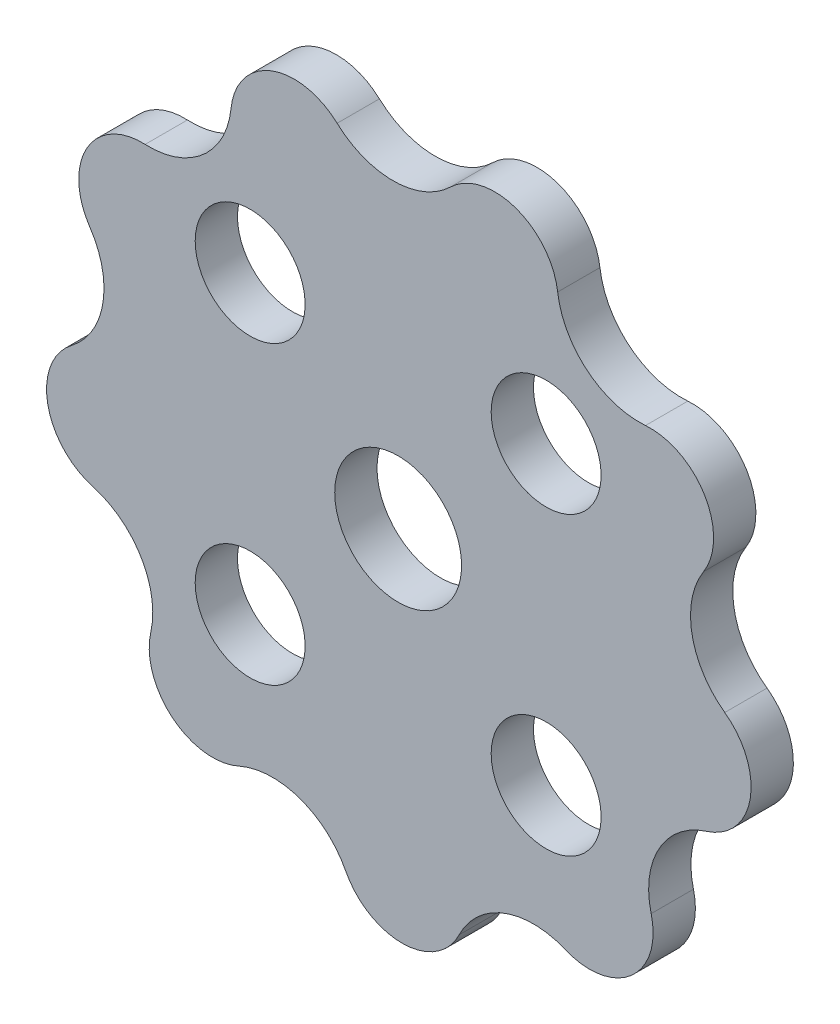
ISO-10303-21;
HEADER;
FILE_DESCRIPTION(('STEP AP214'),'2;1');
FILE_NAME('part.step','',(''),(''),'','','');
FILE_SCHEMA(('AUTOMOTIVE_DESIGN { 1 0 10303 214 1 1 1 1 }'));
ENDSEC;
DATA;
#1=APPLICATION_CONTEXT('core data for automotive mechanical design processes');
#2=APPLICATION_PROTOCOL_DEFINITION('international standard','automotive_design',2000,#1);
#3=PRODUCT_CONTEXT('',#1,'mechanical');
#4=PRODUCT('Part','Part','',(#3));
#5=PRODUCT_RELATED_PRODUCT_CATEGORY('part','',(#4));
#6=PRODUCT_DEFINITION_FORMATION('','',#4);
#7=PRODUCT_DEFINITION_CONTEXT('part definition',#1,'design');
#8=PRODUCT_DEFINITION('design','',#6,#7);
#9=PRODUCT_DEFINITION_SHAPE('','',#8);
#10=(LENGTH_UNIT() NAMED_UNIT(*) SI_UNIT(.MILLI.,.METRE.));
#11=(NAMED_UNIT(*) PLANE_ANGLE_UNIT() SI_UNIT($,.RADIAN.));
#12=(NAMED_UNIT(*) SI_UNIT($,.STERADIAN.) SOLID_ANGLE_UNIT());
#13=UNCERTAINTY_MEASURE_WITH_UNIT(LENGTH_MEASURE(1.E-05),#10,'distance_accuracy_value','');
#14=(GEOMETRIC_REPRESENTATION_CONTEXT(3) GLOBAL_UNCERTAINTY_ASSIGNED_CONTEXT((#13)) GLOBAL_UNIT_ASSIGNED_CONTEXT((#10,
#11,#12)) REPRESENTATION_CONTEXT('',''));
#15=CARTESIAN_POINT('',(0.,0.,0.));
#16=DIRECTION('',(0.,0.,1.));
#17=DIRECTION('',(1.,0.,0.));
#18=AXIS2_PLACEMENT_3D('',#15,#16,#17);
#19=CARTESIAN_POINT('',(-1.21116769376449,90.2255107127934,10.));
#20=DIRECTION('',(0.,0.,-1.));
#21=DIRECTION('',(-1.,0.,0.));
#22=AXIS2_PLACEMENT_3D('',#19,#20,#21);
#23=CYLINDRICAL_SURFACE('',#22,19.5);
#24=CARTESIAN_POINT('',(-1.21116769376449,90.2255107127934,0.));
#25=DIRECTION('',(0.,0.,1.));
#26=DIRECTION('',(1.,0.,0.));
#27=AXIS2_PLACEMENT_3D('',#24,#25,#26);
#28=CIRCLE('',#27,19.5);
#29=CARTESIAN_POINT('',(-14.4304452799696,75.890215107231,0.));
#30=VERTEX_POINT('',#29);
#31=CARTESIAN_POINT('',(12.3881450375755,76.2502220490406,0.));
#32=VERTEX_POINT('',#31);
#33=EDGE_CURVE('E203',#30,#32,#28,.T.);
#34=ORIENTED_EDGE('',*,*,#33,.F.);
#35=DIRECTION('',(0.,0.,-1.));
#36=VECTOR('',#35,1.);
#37=CARTESIAN_POINT('',(-14.4304452799696,75.890215107231,10.));
#38=LINE('',#37,#36);
#39=CARTESIAN_POINT('',(-14.4304452799696,75.890215107231,10.));
#40=VERTEX_POINT('',#39);
#41=EDGE_CURVE('E11',#40,#30,#38,.T.);
#42=ORIENTED_EDGE('',*,*,#41,.F.);
#43=CARTESIAN_POINT('',(-1.21116769376449,90.2255107127934,10.));
#44=DIRECTION('',(0.,0.,1.));
#45=DIRECTION('',(1.,0.,0.));
#46=AXIS2_PLACEMENT_3D('',#43,#44,#45);
#47=CIRCLE('',#46,19.5);
#48=CARTESIAN_POINT('',(12.3881450375755,76.2502220490406,10.));
#49=VERTEX_POINT('',#48);
#50=EDGE_CURVE('E272',#40,#49,#47,.T.);
#51=ORIENTED_EDGE('',*,*,#50,.T.);
#52=DIRECTION('',(0.,0.,-1.));
#53=VECTOR('',#52,1.);
#54=CARTESIAN_POINT('',(12.3881450375755,76.2502220490406,10.));
#55=LINE('',#54,#53);
#56=EDGE_CURVE('E62',#49,#32,#55,.T.);
#57=ORIENTED_EDGE('',*,*,#56,.T.);
#58=EDGE_LOOP('',(#34,#42,#51,#57));
#59=FACE_BOUND('',#58,.T.);
#60=ADVANCED_FACE('F45',(#59),#23,.F.);
#61=CARTESIAN_POINT('',(-24.5991203462812,64.8630646414138,10.));
#62=DIRECTION('',(0.,0.,-1.));
#63=DIRECTION('',(-1.,0.,0.));
#64=AXIS2_PLACEMENT_3D('',#61,#62,#63);
#65=CYLINDRICAL_SURFACE('',#64,15.);
#66=CARTESIAN_POINT('',(-24.5991203462812,64.8630646414138,0.));
#67=DIRECTION('',(0.,0.,1.));
#68=DIRECTION('',(1.,0.,0.));
#69=AXIS2_PLACEMENT_3D('',#66,#67,#68);
#70=CIRCLE('',#69,15.);
#71=CARTESIAN_POINT('',(-39.5228283023836,66.3740050244089,0.));
#72=VERTEX_POINT('',#71);
#73=EDGE_CURVE('E206',#72,#30,#70,.F.);
#74=ORIENTED_EDGE('',*,*,#73,.F.);
#75=DIRECTION('',(0.,0.,-1.));
#76=VECTOR('',#75,1.);
#77=CARTESIAN_POINT('',(-39.5228283023836,66.3740050244089,10.));
#78=LINE('',#77,#76);
#79=CARTESIAN_POINT('',(-39.5228283023836,66.3740050244089,10.));
#80=VERTEX_POINT('',#79);
#81=EDGE_CURVE('E54',#80,#72,#78,.T.);
#82=ORIENTED_EDGE('',*,*,#81,.F.);
#83=CARTESIAN_POINT('',(-24.5991203462812,64.8630646414138,10.));
#84=DIRECTION('',(0.,0.,1.));
#85=DIRECTION('',(1.,0.,0.));
#86=AXIS2_PLACEMENT_3D('',#83,#84,#85);
#87=CIRCLE('',#86,15.);
#88=EDGE_CURVE('E337',#80,#40,#87,.F.);
#89=ORIENTED_EDGE('',*,*,#88,.T.);
#90=ORIENTED_EDGE('',*,*,#41,.T.);
#91=EDGE_LOOP('',(#74,#82,#89,#90));
#92=FACE_BOUND('',#91,.T.);
#93=ADVANCED_FACE('F325',(#92),#65,.T.);
#94=CARTESIAN_POINT('',(-58.9236486453168,68.3382275223026,10.));
#95=DIRECTION('',(0.,0.,-1.));
#96=DIRECTION('',(-1.,0.,0.));
#97=AXIS2_PLACEMENT_3D('',#94,#95,#96);
#98=CYLINDRICAL_SURFACE('',#97,19.5);
#99=CARTESIAN_POINT('',(-58.9236486453168,68.3382275223026,0.));
#100=DIRECTION('',(0.,0.,1.));
#101=DIRECTION('',(1.,0.,0.));
#102=AXIS2_PLACEMENT_3D('',#99,#100,#101);
#103=CIRCLE('',#102,19.5);
#104=CARTESIAN_POINT('',(-59.835652385827,48.8595661417741,0.));
#105=VERTEX_POINT('',#104);
#106=EDGE_CURVE('E211',#105,#72,#103,.T.);
#107=ORIENTED_EDGE('',*,*,#106,.F.);
#108=DIRECTION('',(0.,0.,-1.));
#109=VECTOR('',#108,1.);
#110=CARTESIAN_POINT('',(-59.835652385827,48.8595661417741,10.));
#111=LINE('',#110,#109);
#112=CARTESIAN_POINT('',(-59.835652385827,48.8595661417741,10.));
#113=VERTEX_POINT('',#112);
#114=EDGE_CURVE('E312',#113,#105,#111,.T.);
#115=ORIENTED_EDGE('',*,*,#114,.F.);
#116=CARTESIAN_POINT('',(-58.9236486453168,68.3382275223026,10.));
#117=DIRECTION('',(0.,0.,1.));
#118=DIRECTION('',(1.,0.,0.));
#119=AXIS2_PLACEMENT_3D('',#116,#117,#118);
#120=CIRCLE('',#119,19.5);
#121=EDGE_CURVE('E321',#113,#80,#120,.T.);
#122=ORIENTED_EDGE('',*,*,#121,.T.);
#123=ORIENTED_EDGE('',*,*,#81,.T.);
#124=EDGE_LOOP('',(#107,#115,#122,#123));
#125=FACE_BOUND('',#124,.T.);
#126=ADVANCED_FACE('F319',(#125),#98,.F.);
#127=CARTESIAN_POINT('',(-60.5371937246811,33.8759804644444,10.));
#128=DIRECTION('',(0.,0.,-1.));
#129=DIRECTION('',(-1.,0.,0.));
#130=AXIS2_PLACEMENT_3D('',#127,#128,#129);
#131=CYLINDRICAL_SURFACE('',#130,15.);
#132=CARTESIAN_POINT('',(-60.5371937246811,33.8759804644444,0.));
#133=DIRECTION('',(0.,0.,1.));
#134=DIRECTION('',(1.,0.,0.));
#135=AXIS2_PLACEMENT_3D('',#132,#133,#134);
#136=CIRCLE('',#135,15.);
#137=CARTESIAN_POINT('',(-72.9406310323482,25.4406533839589,0.));
#138=VERTEX_POINT('',#137);
#139=EDGE_CURVE('E215',#138,#105,#136,.F.);
#140=ORIENTED_EDGE('',*,*,#139,.F.);
#141=DIRECTION('',(0.,0.,-1.));
#142=VECTOR('',#141,1.);
#143=CARTESIAN_POINT('',(-72.9406310323482,25.4406533839589,10.));
#144=LINE('',#143,#142);
#145=CARTESIAN_POINT('',(-72.9406310323482,25.4406533839589,10.));
#146=VERTEX_POINT('',#145);
#147=EDGE_CURVE('E309',#146,#138,#144,.T.);
#148=ORIENTED_EDGE('',*,*,#147,.F.);
#149=CARTESIAN_POINT('',(-60.5371937246811,33.8759804644444,10.));
#150=DIRECTION('',(0.,0.,1.));
#151=DIRECTION('',(1.,0.,0.));
#152=AXIS2_PLACEMENT_3D('',#149,#150,#151);
#153=CIRCLE('',#152,15.);
#154=EDGE_CURVE('E334',#146,#113,#153,.F.);
#155=ORIENTED_EDGE('',*,*,#154,.T.);
#156=ORIENTED_EDGE('',*,*,#114,.T.);
#157=EDGE_LOOP('',(#140,#148,#155,#156));
#158=FACE_BOUND('',#157,.T.);
#159=ADVANCED_FACE('F331',(#158),#131,.T.);
#160=CARTESIAN_POINT('',(-89.0650995323154,14.4747281793276,10.));
#161=DIRECTION('',(0.,0.,-1.));
#162=DIRECTION('',(-1.,0.,0.));
#163=AXIS2_PLACEMENT_3D('',#160,#161,#162);
#164=CYLINDRICAL_SURFACE('',#163,19.5);
#165=CARTESIAN_POINT('',(-89.0650995323154,14.4747281793276,0.));
#166=DIRECTION('',(0.,0.,1.));
#167=DIRECTION('',(1.,0.,0.));
#168=AXIS2_PLACEMENT_3D('',#165,#166,#167);
#169=CIRCLE('',#168,19.5);
#170=CARTESIAN_POINT('',(-77.2430927411535,-1.03301683501032,0.));
#171=VERTEX_POINT('',#170);
#172=EDGE_CURVE('E219',#171,#138,#169,.T.);
#173=ORIENTED_EDGE('',*,*,#172,.F.);
#174=DIRECTION('',(0.,0.,-1.));
#175=VECTOR('',#174,1.);
#176=CARTESIAN_POINT('',(-77.2430927411535,-1.03301683501032,10.));
#177=LINE('',#176,#175);
#178=CARTESIAN_POINT('',(-77.2430927411535,-1.03301683501032,10.));
#179=VERTEX_POINT('',#178);
#180=EDGE_CURVE('E306',#179,#171,#177,.T.);
#181=ORIENTED_EDGE('',*,*,#180,.F.);
#182=CARTESIAN_POINT('',(-89.0650995323154,14.4747281793276,10.));
#183=DIRECTION('',(0.,0.,1.));
#184=DIRECTION('',(1.,0.,0.));
#185=AXIS2_PLACEMENT_3D('',#182,#183,#184);
#186=CIRCLE('',#185,19.5);
#187=EDGE_CURVE('E342',#179,#146,#186,.T.);
#188=ORIENTED_EDGE('',*,*,#187,.T.);
#189=ORIENTED_EDGE('',*,*,#147,.T.);
#190=EDGE_LOOP('',(#173,#181,#188,#189));
#191=FACE_BOUND('',#190,.T.);
#192=ADVANCED_FACE('F411',(#191),#164,.F.);
#193=CARTESIAN_POINT('',(-68.1492413633367,-12.9620514614241,10.));
#194=DIRECTION('',(0.,0.,-1.));
#195=DIRECTION('',(-1.,0.,0.));
#196=AXIS2_PLACEMENT_3D('',#193,#194,#195);
#197=CYLINDRICAL_SURFACE('',#196,15.);
#198=CARTESIAN_POINT('',(-68.1492413633367,-12.9620514614241,0.));
#199=DIRECTION('',(0.,0.,1.));
#200=DIRECTION('',(1.,0.,0.));
#201=AXIS2_PLACEMENT_3D('',#198,#199,#200);
#202=CIRCLE('',#201,15.);
#203=CARTESIAN_POINT('',(-72.2287018574602,-27.3966627162132,0.));
#204=VERTEX_POINT('',#203);
#205=EDGE_CURVE('E223',#204,#171,#202,.F.);
#206=ORIENTED_EDGE('',*,*,#205,.F.);
#207=DIRECTION('',(0.,0.,-1.));
#208=VECTOR('',#207,1.);
#209=CARTESIAN_POINT('',(-72.2287018574602,-27.3966627162132,10.));
#210=LINE('',#209,#208);
#211=CARTESIAN_POINT('',(-72.2287018574602,-27.3966627162132,10.));
#212=VERTEX_POINT('',#211);
#213=EDGE_CURVE('E303',#212,#204,#210,.T.);
#214=ORIENTED_EDGE('',*,*,#213,.F.);
#215=CARTESIAN_POINT('',(-68.1492413633367,-12.9620514614241,10.));
#216=DIRECTION('',(0.,0.,1.));
#217=DIRECTION('',(1.,0.,0.));
#218=AXIS2_PLACEMENT_3D('',#215,#216,#217);
#219=CIRCLE('',#218,15.);
#220=EDGE_CURVE('E349',#212,#179,#219,.F.);
#221=ORIENTED_EDGE('',*,*,#220,.T.);
#222=ORIENTED_EDGE('',*,*,#180,.T.);
#223=EDGE_LOOP('',(#206,#214,#221,#222));
#224=FACE_BOUND('',#223,.T.);
#225=ADVANCED_FACE('F414',(#224),#197,.T.);
#226=CARTESIAN_POINT('',(-77.5320004998208,-46.1616573474391,10.));
#227=DIRECTION('',(0.,0.,-1.));
#228=DIRECTION('',(-1.,0.,0.));
#229=AXIS2_PLACEMENT_3D('',#226,#227,#228);
#230=CYLINDRICAL_SURFACE('',#229,19.5);
#231=CARTESIAN_POINT('',(-77.5320004998208,-46.1616573474391,0.));
#232=DIRECTION('',(0.,0.,1.));
#233=DIRECTION('',(1.,0.,0.));
#234=AXIS2_PLACEMENT_3D('',#231,#232,#233);
#235=CIRCLE('',#234,19.5);
#236=CARTESIAN_POINT('',(-58.5076315415418,-50.4422397539898,0.));
#237=VERTEX_POINT('',#236);
#238=EDGE_CURVE('E227',#237,#204,#235,.T.);
#239=ORIENTED_EDGE('',*,*,#238,.F.);
#240=DIRECTION('',(0.,0.,-1.));
#241=VECTOR('',#240,1.);
#242=CARTESIAN_POINT('',(-58.5076315415418,-50.4422397539898,10.));
#243=LINE('',#242,#241);
#244=CARTESIAN_POINT('',(-58.5076315415418,-50.4422397539898,10.));
#245=VERTEX_POINT('',#244);
#246=EDGE_CURVE('E300',#245,#237,#243,.T.);
#247=ORIENTED_EDGE('',*,*,#246,.F.);
#248=CARTESIAN_POINT('',(-77.5320004998208,-46.1616573474391,10.));
#249=DIRECTION('',(0.,0.,1.));
#250=DIRECTION('',(1.,0.,0.));
#251=AXIS2_PLACEMENT_3D('',#248,#249,#250);
#252=CIRCLE('',#251,19.5);
#253=EDGE_CURVE('E353',#245,#212,#252,.T.);
#254=ORIENTED_EDGE('',*,*,#253,.T.);
#255=ORIENTED_EDGE('',*,*,#213,.T.);
#256=EDGE_LOOP('',(#239,#247,#254,#255));
#257=FACE_BOUND('',#256,.T.);
#258=ADVANCED_FACE('F418',(#257),#230,.F.);
#259=CARTESIAN_POINT('',(-43.8735015736349,-53.7349954513364,10.));
#260=DIRECTION('',(0.,0.,-1.));
#261=DIRECTION('',(-1.,0.,0.));
#262=AXIS2_PLACEMENT_3D('',#259,#260,#261);
#263=CYLINDRICAL_SURFACE('',#262,15.);
#264=CARTESIAN_POINT('',(-43.8735015736349,-53.7349954513364,0.));
#265=DIRECTION('',(0.,0.,1.));
#266=DIRECTION('',(1.,0.,0.));
#267=AXIS2_PLACEMENT_3D('',#264,#265,#266);
#268=CIRCLE('',#267,15.);
#269=CARTESIAN_POINT('',(-37.7201603508614,-67.4147758514787,0.));
#270=VERTEX_POINT('',#269);
#271=EDGE_CURVE('E231',#270,#237,#268,.F.);
#272=ORIENTED_EDGE('',*,*,#271,.F.);
#273=DIRECTION('',(0.,0.,-1.));
#274=VECTOR('',#273,1.);
#275=CARTESIAN_POINT('',(-37.7201603508614,-67.4147758514787,10.));
#276=LINE('',#275,#274);
#277=CARTESIAN_POINT('',(-37.7201603508614,-67.4147758514787,10.));
#278=VERTEX_POINT('',#277);
#279=EDGE_CURVE('E297',#278,#270,#276,.T.);
#280=ORIENTED_EDGE('',*,*,#279,.F.);
#281=CARTESIAN_POINT('',(-43.8735015736349,-53.7349954513364,10.));
#282=DIRECTION('',(0.,0.,1.));
#283=DIRECTION('',(1.,0.,0.));
#284=AXIS2_PLACEMENT_3D('',#281,#282,#283);
#285=CIRCLE('',#284,15.);
#286=EDGE_CURVE('E357',#278,#245,#285,.F.);
#287=ORIENTED_EDGE('',*,*,#286,.T.);
#288=ORIENTED_EDGE('',*,*,#246,.T.);
#289=EDGE_LOOP('',(#272,#280,#287,#288));
#290=FACE_BOUND('',#289,.T.);
#291=ADVANCED_FACE('F422',(#290),#263,.T.);
#292=CARTESIAN_POINT('',(-29.7208167612556,-85.1984903716636,10.));
#293=DIRECTION('',(0.,0.,-1.));
#294=DIRECTION('',(-1.,0.,0.));
#295=AXIS2_PLACEMENT_3D('',#292,#293,#294);
#296=CYLINDRICAL_SURFACE('',#295,19.5);
#297=CARTESIAN_POINT('',(-29.7208167612556,-85.1984903716636,0.));
#298=DIRECTION('',(0.,0.,1.));
#299=DIRECTION('',(1.,0.,0.));
#300=AXIS2_PLACEMENT_3D('',#297,#298,#299);
#301=CIRCLE('',#300,19.5);
#302=CARTESIAN_POINT('',(-12.3957993037479,-76.2489780890276,0.));
#303=VERTEX_POINT('',#302);
#304=EDGE_CURVE('E235',#303,#270,#301,.T.);
#305=ORIENTED_EDGE('',*,*,#304,.F.);
#306=DIRECTION('',(0.,0.,-1.));
#307=VECTOR('',#306,1.);
#308=CARTESIAN_POINT('',(-12.3957993037479,-76.2489780890276,10.));
#309=LINE('',#308,#307);
#310=CARTESIAN_POINT('',(-12.3957993037479,-76.2489780890276,10.));
#311=VERTEX_POINT('',#310);
#312=EDGE_CURVE('E294',#311,#303,#309,.T.);
#313=ORIENTED_EDGE('',*,*,#312,.F.);
#314=CARTESIAN_POINT('',(-29.7208167612556,-85.1984903716636,10.));
#315=DIRECTION('',(0.,0.,1.));
#316=DIRECTION('',(1.,0.,0.));
#317=AXIS2_PLACEMENT_3D('',#314,#315,#316);
#318=CIRCLE('',#317,19.5);
#319=EDGE_CURVE('E361',#311,#278,#318,.T.);
#320=ORIENTED_EDGE('',*,*,#319,.T.);
#321=ORIENTED_EDGE('',*,*,#279,.T.);
#322=EDGE_LOOP('',(#305,#313,#320,#321));
#323=FACE_BOUND('',#322,.T.);
#324=ADVANCED_FACE('F426',(#323),#296,.F.);
#325=CARTESIAN_POINT('',(0.931137202027298,-69.3647378716153,10.));
#326=DIRECTION('',(0.,0.,-1.));
#327=DIRECTION('',(-1.,0.,0.));
#328=AXIS2_PLACEMENT_3D('',#325,#326,#327);
#329=CYLINDRICAL_SURFACE('',#328,15.);
#330=CARTESIAN_POINT('',(0.931137202027298,-69.3647378716153,0.));
#331=DIRECTION('',(0.,0.,1.));
#332=DIRECTION('',(1.,0.,0.));
#333=AXIS2_PLACEMENT_3D('',#330,#331,#332);
#334=CIRCLE('',#333,15.);
#335=CARTESIAN_POINT('',(14.4380633967921,-75.8887661340599,0.));
#336=VERTEX_POINT('',#335);
#337=EDGE_CURVE('E239',#336,#303,#334,.F.);
#338=ORIENTED_EDGE('',*,*,#337,.F.);
#339=DIRECTION('',(0.,0.,-1.));
#340=VECTOR('',#339,1.);
#341=CARTESIAN_POINT('',(14.4380633967921,-75.8887661340599,10.));
#342=LINE('',#341,#340);
#343=CARTESIAN_POINT('',(14.4380633967921,-75.8887661340599,10.));
#344=VERTEX_POINT('',#343);
#345=EDGE_CURVE('E291',#344,#336,#342,.T.);
#346=ORIENTED_EDGE('',*,*,#345,.F.);
#347=CARTESIAN_POINT('',(0.931137202027298,-69.3647378716153,10.));
#348=DIRECTION('',(0.,0.,1.));
#349=DIRECTION('',(1.,0.,0.));
#350=AXIS2_PLACEMENT_3D('',#347,#348,#349);
#351=CIRCLE('',#350,15.);
#352=EDGE_CURVE('E365',#344,#311,#351,.F.);
#353=ORIENTED_EDGE('',*,*,#352,.T.);
#354=ORIENTED_EDGE('',*,*,#312,.T.);
#355=EDGE_LOOP('',(#338,#346,#353,#354));
#356=FACE_BOUND('',#355,.T.);
#357=ADVANCED_FACE('F430',(#356),#329,.T.);
#358=CARTESIAN_POINT('',(31.9970674499864,-84.3700028752378,10.));
#359=DIRECTION('',(0.,0.,-1.));
#360=DIRECTION('',(-1.,0.,0.));
#361=AXIS2_PLACEMENT_3D('',#358,#359,#360);
#362=CYLINDRICAL_SURFACE('',#361,19.5);
#363=CARTESIAN_POINT('',(31.9970674499864,-84.3700028752378,0.));
#364=DIRECTION('',(0.,0.,1.));
#365=DIRECTION('',(1.,0.,0.));
#366=AXIS2_PLACEMENT_3D('',#363,#364,#365);
#367=CIRCLE('',#366,19.5);
#368=CARTESIAN_POINT('',(39.5161651922336,-66.3779721632105,0.));
#369=VERTEX_POINT('',#368);
#370=EDGE_CURVE('E243',#369,#336,#367,.T.);
#371=ORIENTED_EDGE('',*,*,#370,.F.);
#372=DIRECTION('',(0.,0.,-1.));
#373=VECTOR('',#372,1.);
#374=CARTESIAN_POINT('',(39.5161651922336,-66.3779721632105,10.));
#375=LINE('',#374,#373);
#376=CARTESIAN_POINT('',(39.5161651922336,-66.3779721632105,10.));
#377=VERTEX_POINT('',#376);
#378=EDGE_CURVE('E288',#377,#369,#375,.T.);
#379=ORIENTED_EDGE('',*,*,#378,.F.);
#380=CARTESIAN_POINT('',(31.9970674499864,-84.3700028752378,10.));
#381=DIRECTION('',(0.,0.,1.));
#382=DIRECTION('',(1.,0.,0.));
#383=AXIS2_PLACEMENT_3D('',#380,#381,#382);
#384=CIRCLE('',#383,19.5);
#385=EDGE_CURVE('E369',#377,#344,#384,.T.);
#386=ORIENTED_EDGE('',*,*,#385,.T.);
#387=ORIENTED_EDGE('',*,*,#345,.T.);
#388=EDGE_LOOP('',(#371,#379,#386,#387));
#389=FACE_BOUND('',#388,.T.);
#390=ADVANCED_FACE('F434',(#389),#362,.F.);
#391=CARTESIAN_POINT('',(45.3000865324238,-52.5379485385741,10.));
#392=DIRECTION('',(0.,0.,-1.));
#393=DIRECTION('',(-1.,0.,0.));
#394=AXIS2_PLACEMENT_3D('',#391,#392,#393);
#395=CYLINDRICAL_SURFACE('',#394,15.);
#396=CARTESIAN_POINT('',(45.3000865324238,-52.5379485385741,0.));
#397=DIRECTION('',(0.,0.,1.));
#398=DIRECTION('',(1.,0.,0.));
#399=AXIS2_PLACEMENT_3D('',#396,#397,#398);
#400=CIRCLE('',#399,15.);
#401=CARTESIAN_POINT('',(59.8405568198857,-48.8535593328256,0.));
#402=VERTEX_POINT('',#401);
#403=EDGE_CURVE('E247',#402,#369,#400,.F.);
#404=ORIENTED_EDGE('',*,*,#403,.F.);
#405=DIRECTION('',(0.,0.,-1.));
#406=VECTOR('',#405,1.);
#407=CARTESIAN_POINT('',(59.8405568198857,-48.8535593328256,10.));
#408=LINE('',#407,#406);
#409=CARTESIAN_POINT('',(59.8405568198857,-48.8535593328256,10.));
#410=VERTEX_POINT('',#409);
#411=EDGE_CURVE('E285',#410,#402,#408,.T.);
#412=ORIENTED_EDGE('',*,*,#411,.F.);
#413=CARTESIAN_POINT('',(45.3000865324238,-52.5379485385741,10.));
#414=DIRECTION('',(0.,0.,1.));
#415=DIRECTION('',(1.,0.,0.));
#416=AXIS2_PLACEMENT_3D('',#413,#414,#415);
#417=CIRCLE('',#416,15.);
#418=EDGE_CURVE('E373',#410,#377,#417,.F.);
#419=ORIENTED_EDGE('',*,*,#418,.T.);
#420=ORIENTED_EDGE('',*,*,#378,.T.);
#421=EDGE_LOOP('',(#404,#412,#419,#420));
#422=FACE_BOUND('',#421,.T.);
#423=ADVANCED_FACE('F438',(#422),#395,.T.);
#424=CARTESIAN_POINT('',(78.7431681935863,-44.0638533653525,10.));
#425=DIRECTION('',(0.,0.,-1.));
#426=DIRECTION('',(-1.,0.,0.));
#427=AXIS2_PLACEMENT_3D('',#424,#425,#426);
#428=CYLINDRICAL_SURFACE('',#427,19.5);
#429=CARTESIAN_POINT('',(78.7431681935863,-44.0638533653525,0.));
#430=DIRECTION('',(0.,0.,1.));
#431=DIRECTION('',(1.,0.,0.));
#432=AXIS2_PLACEMENT_3D('',#429,#430,#431);
#433=CIRCLE('',#432,19.5);
#434=CARTESIAN_POINT('',(72.9380768215124,-25.4479753532394,0.));
#435=VERTEX_POINT('',#434);
#436=EDGE_CURVE('E251',#435,#402,#433,.T.);
#437=ORIENTED_EDGE('',*,*,#436,.F.);
#438=DIRECTION('',(0.,0.,-1.));
#439=VECTOR('',#438,1.);
#440=CARTESIAN_POINT('',(72.9380768215124,-25.4479753532394,10.));
#441=LINE('',#440,#439);
#442=CARTESIAN_POINT('',(72.9380768215124,-25.4479753532394,10.));
#443=VERTEX_POINT('',#442);
#444=EDGE_CURVE('E282',#443,#435,#441,.T.);
#445=ORIENTED_EDGE('',*,*,#444,.F.);
#446=CARTESIAN_POINT('',(78.7431681935863,-44.0638533653525,10.));
#447=DIRECTION('',(0.,0.,1.));
#448=DIRECTION('',(1.,0.,0.));
#449=AXIS2_PLACEMENT_3D('',#446,#447,#448);
#450=CIRCLE('',#449,19.5);
#451=EDGE_CURVE('E377',#443,#410,#450,.T.);
#452=ORIENTED_EDGE('',*,*,#451,.T.);
#453=ORIENTED_EDGE('',*,*,#411,.T.);
#454=EDGE_LOOP('',(#437,#445,#452,#453));
#455=FACE_BOUND('',#454,.T.);
#456=ADVANCED_FACE('F442',(#455),#428,.F.);
#457=CARTESIAN_POINT('',(68.472621919917,-11.1280691900756,10.));
#458=DIRECTION('',(0.,0.,-1.));
#459=DIRECTION('',(-1.,0.,0.));
#460=AXIS2_PLACEMENT_3D('',#457,#458,#459);
#461=CYLINDRICAL_SURFACE('',#460,15.);
#462=CARTESIAN_POINT('',(68.472621919917,-11.1280691900756,0.));
#463=DIRECTION('',(0.,0.,1.));
#464=DIRECTION('',(1.,0.,0.));
#465=AXIS2_PLACEMENT_3D('',#462,#463,#464);
#466=CIRCLE('',#465,15.);
#467=CARTESIAN_POINT('',(77.2429886532459,1.04077082707148,0.));
#468=VERTEX_POINT('',#467);
#469=EDGE_CURVE('E255',#468,#435,#466,.F.);
#470=ORIENTED_EDGE('',*,*,#469,.F.);
#471=DIRECTION('',(0.,0.,-1.));
#472=VECTOR('',#471,1.);
#473=CARTESIAN_POINT('',(77.2429886532459,1.04077082707148,10.));
#474=LINE('',#473,#472);
#475=CARTESIAN_POINT('',(77.2429886532459,1.04077082707148,10.));
#476=VERTEX_POINT('',#475);
#477=EDGE_CURVE('E279',#476,#468,#474,.T.);
#478=ORIENTED_EDGE('',*,*,#477,.F.);
#479=CARTESIAN_POINT('',(68.472621919917,-11.1280691900756,10.));
#480=DIRECTION('',(0.,0.,1.));
#481=DIRECTION('',(1.,0.,0.));
#482=AXIS2_PLACEMENT_3D('',#479,#480,#481);
#483=CIRCLE('',#482,15.);
#484=EDGE_CURVE('E381',#476,#443,#483,.F.);
#485=ORIENTED_EDGE('',*,*,#484,.T.);
#486=ORIENTED_EDGE('',*,*,#444,.T.);
#487=EDGE_LOOP('',(#470,#478,#485,#486));
#488=FACE_BOUND('',#487,.T.);
#489=ADVANCED_FACE('F446',(#488),#461,.T.);
#490=CARTESIAN_POINT('',(88.6444654065733,16.8602628493627,10.));
#491=DIRECTION('',(0.,0.,-1.));
#492=DIRECTION('',(-1.,0.,0.));
#493=AXIS2_PLACEMENT_3D('',#490,#491,#492);
#494=CYLINDRICAL_SURFACE('',#493,19.5);
#495=CARTESIAN_POINT('',(88.6444654065733,16.8602628493627,0.));
#496=DIRECTION('',(0.,0.,1.));
#497=DIRECTION('',(1.,0.,0.));
#498=AXIS2_PLACEMENT_3D('',#495,#496,#497);
#499=CIRCLE('',#498,19.5);
#500=CARTESIAN_POINT('',(72.2314516895758,27.3894119472553,0.));
#501=VERTEX_POINT('',#500);
#502=EDGE_CURVE('E259',#501,#468,#499,.T.);
#503=ORIENTED_EDGE('',*,*,#502,.F.);
#504=DIRECTION('',(0.,0.,-1.));
#505=VECTOR('',#504,1.);
#506=CARTESIAN_POINT('',(72.2314516895758,27.3894119472553,10.));
#507=LINE('',#506,#505);
#508=CARTESIAN_POINT('',(72.2314516895758,27.3894119472553,10.));
#509=VERTEX_POINT('',#508);
#510=EDGE_CURVE('E182',#509,#501,#507,.T.);
#511=ORIENTED_EDGE('',*,*,#510,.F.);
#512=CARTESIAN_POINT('',(88.6444654065733,16.8602628493627,10.));
#513=DIRECTION('',(0.,0.,1.));
#514=DIRECTION('',(1.,0.,0.));
#515=AXIS2_PLACEMENT_3D('',#512,#513,#514);
#516=CIRCLE('',#515,19.5);
#517=EDGE_CURVE('E192',#509,#476,#516,.T.);
#518=ORIENTED_EDGE('',*,*,#517,.T.);
#519=ORIENTED_EDGE('',*,*,#477,.T.);
#520=EDGE_LOOP('',(#503,#511,#518,#519));
#521=FACE_BOUND('',#520,.T.);
#522=ADVANCED_FACE('F387',(#521),#494,.F.);
#523=CARTESIAN_POINT('',(59.6060565226547,35.4887574071727,10.));
#524=DIRECTION('',(0.,0.,-1.));
#525=DIRECTION('',(-1.,0.,0.));
#526=AXIS2_PLACEMENT_3D('',#523,#524,#525);
#527=CYLINDRICAL_SURFACE('',#526,15.);
#528=CARTESIAN_POINT('',(59.6060565226547,35.4887574071727,0.));
#529=DIRECTION('',(0.,0.,1.));
#530=DIRECTION('',(1.,0.,0.));
#531=AXIS2_PLACEMENT_3D('',#528,#529,#530);
#532=CIRCLE('',#531,15.);
#533=CARTESIAN_POINT('',(58.502567635557,50.4481127501028,0.));
#534=VERTEX_POINT('',#533);
#535=EDGE_CURVE('E177',#534,#501,#532,.F.);
#536=ORIENTED_EDGE('',*,*,#535,.F.);
#537=DIRECTION('',(0.,0.,-1.));
#538=VECTOR('',#537,1.);
#539=CARTESIAN_POINT('',(58.502567635557,50.4481127501028,10.));
#540=LINE('',#539,#538);
#541=CARTESIAN_POINT('',(58.502567635557,50.4481127501028,10.));
#542=VERTEX_POINT('',#541);
#543=EDGE_CURVE('E172',#542,#534,#540,.T.);
#544=ORIENTED_EDGE('',*,*,#543,.F.);
#545=CARTESIAN_POINT('',(59.6060565226547,35.4887574071727,10.));
#546=DIRECTION('',(0.,0.,1.));
#547=DIRECTION('',(1.,0.,0.));
#548=AXIS2_PLACEMENT_3D('',#545,#546,#547);
#549=CIRCLE('',#548,15.);
#550=EDGE_CURVE('E175',#542,#509,#549,.F.);
#551=ORIENTED_EDGE('',*,*,#550,.T.);
#552=ORIENTED_EDGE('',*,*,#510,.T.);
#553=EDGE_LOOP('',(#536,#544,#551,#552));
#554=FACE_BOUND('',#553,.T.);
#555=ADVANCED_FACE('F174',(#554),#527,.T.);
#556=CARTESIAN_POINT('',(57.0680320823299,69.8952746959119,10.));
#557=DIRECTION('',(0.,0.,-1.));
#558=DIRECTION('',(-1.,0.,0.));
#559=AXIS2_PLACEMENT_3D('',#556,#557,#558);
#560=CYLINDRICAL_SURFACE('',#559,19.5);
#561=CARTESIAN_POINT('',(57.0680320823299,69.8952746959119,0.));
#562=DIRECTION('',(0.,0.,1.));
#563=DIRECTION('',(1.,0.,0.));
#564=AXIS2_PLACEMENT_3D('',#561,#562,#563);
#565=CIRCLE('',#564,19.5);
#566=CARTESIAN_POINT('',(37.7269275489208,67.4109889982226,0.));
#567=VERTEX_POINT('',#566);
#568=EDGE_CURVE('E265',#567,#534,#565,.T.);
#569=ORIENTED_EDGE('',*,*,#568,.F.);
#570=DIRECTION('',(0.,0.,-1.));
#571=VECTOR('',#570,1.);
#572=CARTESIAN_POINT('',(37.7269275489208,67.4109889982226,10.));
#573=LINE('',#572,#571);
#574=CARTESIAN_POINT('',(37.7269275489208,67.4109889982226,10.));
#575=VERTEX_POINT('',#574);
#576=EDGE_CURVE('E117',#575,#567,#573,.T.);
#577=ORIENTED_EDGE('',*,*,#576,.F.);
#578=CARTESIAN_POINT('',(57.0680320823299,69.8952746959119,10.));
#579=DIRECTION('',(0.,0.,1.));
#580=DIRECTION('',(1.,0.,0.));
#581=AXIS2_PLACEMENT_3D('',#578,#579,#580);
#582=CIRCLE('',#581,19.5);
#583=EDGE_CURVE('E189',#575,#542,#582,.T.);
#584=ORIENTED_EDGE('',*,*,#583,.T.);
#585=ORIENTED_EDGE('',*,*,#543,.T.);
#586=EDGE_LOOP('',(#569,#577,#584,#585));
#587=FACE_BOUND('',#586,.T.);
#588=ADVANCED_FACE('F195',(#587),#560,.F.);
#589=CARTESIAN_POINT('',(22.8491548309138,65.5,10.));
#590=DIRECTION('',(0.,0.,-1.));
#591=DIRECTION('',(-1.,0.,0.));
#592=AXIS2_PLACEMENT_3D('',#589,#590,#591);
#593=CYLINDRICAL_SURFACE('',#592,15.);
#594=CARTESIAN_POINT('',(22.8491548309138,65.5,0.));
#595=DIRECTION('',(0.,0.,1.));
#596=DIRECTION('',(1.,0.,0.));
#597=AXIS2_PLACEMENT_3D('',#594,#595,#596);
#598=CIRCLE('',#597,15.);
#599=EDGE_CURVE('E268',#32,#567,#598,.F.);
#600=ORIENTED_EDGE('',*,*,#599,.F.);
#601=ORIENTED_EDGE('',*,*,#56,.F.);
#602=CARTESIAN_POINT('',(22.8491548309138,65.5,10.));
#603=DIRECTION('',(0.,0.,1.));
#604=DIRECTION('',(1.,0.,0.));
#605=AXIS2_PLACEMENT_3D('',#602,#603,#604);
#606=CIRCLE('',#605,15.);
#607=EDGE_CURVE('E197',#49,#575,#606,.F.);
#608=ORIENTED_EDGE('',*,*,#607,.T.);
#609=ORIENTED_EDGE('',*,*,#576,.T.);
#610=EDGE_LOOP('',(#600,#601,#608,#609));
#611=FACE_BOUND('',#610,.T.);
#612=ADVANCED_FACE('F389',(#611),#593,.T.);
#613=CARTESIAN_POINT('',(0.,0.,10.));
#614=DIRECTION('',(0.,0.,1.));
#615=DIRECTION('',(1.,0.,0.));
#616=AXIS2_PLACEMENT_3D('',#613,#614,#615);
#617=PLANE('',#616);
#618=CARTESIAN_POINT('',(35.0000000000004,-34.9999999999993,10.));
#619=DIRECTION('',(0.,0.,-1.));
#620=DIRECTION('',(-1.,0.,0.));
#621=AXIS2_PLACEMENT_3D('',#618,#619,#620);
#622=CIRCLE('',#621,13.);
#623=CARTESIAN_POINT('',(22.0000000000004,-34.9999999999993,10.));
#624=VERTEX_POINT('',#623);
#625=EDGE_CURVE('E673',#624,#624,#622,.T.);
#626=ORIENTED_EDGE('',*,*,#625,.T.);
#627=EDGE_LOOP('',(#626));
#628=FACE_BOUND('',#627,.T.);
#629=CARTESIAN_POINT('',(-34.9999999999994,-35.0000000000002,10.));
#630=DIRECTION('',(0.,0.,-1.));
#631=DIRECTION('',(-1.,0.,0.));
#632=AXIS2_PLACEMENT_3D('',#629,#630,#631);
#633=CIRCLE('',#632,13.);
#634=CARTESIAN_POINT('',(-47.9999999999994,-35.0000000000002,10.));
#635=VERTEX_POINT('',#634);
#636=EDGE_CURVE('E678',#635,#635,#633,.T.);
#637=ORIENTED_EDGE('',*,*,#636,.T.);
#638=EDGE_LOOP('',(#637));
#639=FACE_BOUND('',#638,.T.);
#640=CARTESIAN_POINT('',(-35.0000000000001,34.9999999999995,10.));
#641=DIRECTION('',(0.,0.,-1.));
#642=DIRECTION('',(-1.,0.,0.));
#643=AXIS2_PLACEMENT_3D('',#640,#641,#642);
#644=CIRCLE('',#643,13.);
#645=CARTESIAN_POINT('',(-48.0000000000001,34.9999999999995,10.));
#646=VERTEX_POINT('',#645);
#647=EDGE_CURVE('E707',#646,#646,#644,.T.);
#648=ORIENTED_EDGE('',*,*,#647,.T.);
#649=EDGE_LOOP('',(#648));
#650=FACE_BOUND('',#649,.T.);
#651=CARTESIAN_POINT('',(0.,0.,10.));
#652=DIRECTION('',(0.,0.,-1.));
#653=DIRECTION('',(-1.,0.,0.));
#654=AXIS2_PLACEMENT_3D('',#651,#652,#653);
#655=CIRCLE('',#654,15.);
#656=CARTESIAN_POINT('',(-15.,0.,10.));
#657=VERTEX_POINT('',#656);
#658=EDGE_CURVE('E699',#657,#657,#655,.T.);
#659=ORIENTED_EDGE('',*,*,#658,.T.);
#660=EDGE_LOOP('',(#659));
#661=FACE_BOUND('',#660,.T.);
#662=CARTESIAN_POINT('',(34.9999999999996,35.,10.));
#663=DIRECTION('',(0.,0.,-1.));
#664=DIRECTION('',(-1.,0.,0.));
#665=AXIS2_PLACEMENT_3D('',#662,#663,#664);
#666=CIRCLE('',#665,13.);
#667=CARTESIAN_POINT('',(21.9999999999996,35.,10.));
#668=VERTEX_POINT('',#667);
#669=EDGE_CURVE('E207',#668,#668,#666,.T.);
#670=ORIENTED_EDGE('',*,*,#669,.T.);
#671=EDGE_LOOP('',(#670));
#672=FACE_BOUND('',#671,.T.);
#673=ORIENTED_EDGE('',*,*,#50,.F.);
#674=ORIENTED_EDGE('',*,*,#88,.F.);
#675=ORIENTED_EDGE('',*,*,#121,.F.);
#676=ORIENTED_EDGE('',*,*,#154,.F.);
#677=ORIENTED_EDGE('',*,*,#187,.F.);
#678=ORIENTED_EDGE('',*,*,#220,.F.);
#679=ORIENTED_EDGE('',*,*,#253,.F.);
#680=ORIENTED_EDGE('',*,*,#286,.F.);
#681=ORIENTED_EDGE('',*,*,#319,.F.);
#682=ORIENTED_EDGE('',*,*,#352,.F.);
#683=ORIENTED_EDGE('',*,*,#385,.F.);
#684=ORIENTED_EDGE('',*,*,#418,.F.);
#685=ORIENTED_EDGE('',*,*,#451,.F.);
#686=ORIENTED_EDGE('',*,*,#484,.F.);
#687=ORIENTED_EDGE('',*,*,#517,.F.);
#688=ORIENTED_EDGE('',*,*,#550,.F.);
#689=ORIENTED_EDGE('',*,*,#583,.F.);
#690=ORIENTED_EDGE('',*,*,#607,.F.);
#691=EDGE_LOOP('',(#673,#674,#675,#676,#677,#678,#679,#680,#681,#682,#683,#684,#685,#686,#687,
#688,#689,#690));
#692=FACE_BOUND('',#691,.T.);
#693=ADVANCED_FACE('F187',(#628,#639,#650,#661,#672,#692),#617,.T.);
#694=CARTESIAN_POINT('',(0.,0.,0.));
#695=DIRECTION('',(0.,0.,1.));
#696=DIRECTION('',(1.,0.,0.));
#697=AXIS2_PLACEMENT_3D('',#694,#695,#696);
#698=PLANE('',#697);
#699=CARTESIAN_POINT('',(35.0000000000004,-34.9999999999993,0.));
#700=DIRECTION('',(0.,0.,-1.));
#701=DIRECTION('',(-1.,0.,0.));
#702=AXIS2_PLACEMENT_3D('',#699,#700,#701);
#703=CIRCLE('',#702,13.);
#704=CARTESIAN_POINT('',(22.0000000000004,-34.9999999999993,0.));
#705=VERTEX_POINT('',#704);
#706=EDGE_CURVE('E676',#705,#705,#703,.T.);
#707=ORIENTED_EDGE('',*,*,#706,.F.);
#708=EDGE_LOOP('',(#707));
#709=FACE_BOUND('',#708,.T.);
#710=CARTESIAN_POINT('',(-34.9999999999994,-35.0000000000002,0.));
#711=DIRECTION('',(0.,0.,-1.));
#712=DIRECTION('',(-1.,0.,0.));
#713=AXIS2_PLACEMENT_3D('',#710,#711,#712);
#714=CIRCLE('',#713,13.);
#715=CARTESIAN_POINT('',(-47.9999999999994,-35.0000000000002,0.));
#716=VERTEX_POINT('',#715);
#717=EDGE_CURVE('E683',#716,#716,#714,.T.);
#718=ORIENTED_EDGE('',*,*,#717,.F.);
#719=EDGE_LOOP('',(#718));
#720=FACE_BOUND('',#719,.T.);
#721=CARTESIAN_POINT('',(-35.0000000000001,34.9999999999995,0.));
#722=DIRECTION('',(0.,0.,-1.));
#723=DIRECTION('',(-1.,0.,0.));
#724=AXIS2_PLACEMENT_3D('',#721,#722,#723);
#725=CIRCLE('',#724,13.);
#726=CARTESIAN_POINT('',(-48.0000000000001,34.9999999999995,0.));
#727=VERTEX_POINT('',#726);
#728=EDGE_CURVE('E703',#727,#727,#725,.T.);
#729=ORIENTED_EDGE('',*,*,#728,.F.);
#730=EDGE_LOOP('',(#729));
#731=FACE_BOUND('',#730,.T.);
#732=CARTESIAN_POINT('',(0.,0.,0.));
#733=DIRECTION('',(0.,0.,-1.));
#734=DIRECTION('',(-1.,0.,0.));
#735=AXIS2_PLACEMENT_3D('',#732,#733,#734);
#736=CIRCLE('',#735,15.);
#737=CARTESIAN_POINT('',(-15.,0.,0.));
#738=VERTEX_POINT('',#737);
#739=EDGE_CURVE('E694',#738,#738,#736,.T.);
#740=ORIENTED_EDGE('',*,*,#739,.F.);
#741=EDGE_LOOP('',(#740));
#742=FACE_BOUND('',#741,.T.);
#743=CARTESIAN_POINT('',(34.9999999999996,35.,0.));
#744=DIRECTION('',(0.,0.,-1.));
#745=DIRECTION('',(-1.,0.,0.));
#746=AXIS2_PLACEMENT_3D('',#743,#744,#745);
#747=CIRCLE('',#746,13.);
#748=CARTESIAN_POINT('',(21.9999999999996,35.,0.));
#749=VERTEX_POINT('',#748);
#750=EDGE_CURVE('E691',#749,#749,#747,.T.);
#751=ORIENTED_EDGE('',*,*,#750,.F.);
#752=EDGE_LOOP('',(#751));
#753=FACE_BOUND('',#752,.T.);
#754=ORIENTED_EDGE('',*,*,#33,.T.);
#755=ORIENTED_EDGE('',*,*,#599,.T.);
#756=ORIENTED_EDGE('',*,*,#568,.T.);
#757=ORIENTED_EDGE('',*,*,#535,.T.);
#758=ORIENTED_EDGE('',*,*,#502,.T.);
#759=ORIENTED_EDGE('',*,*,#469,.T.);
#760=ORIENTED_EDGE('',*,*,#436,.T.);
#761=ORIENTED_EDGE('',*,*,#403,.T.);
#762=ORIENTED_EDGE('',*,*,#370,.T.);
#763=ORIENTED_EDGE('',*,*,#337,.T.);
#764=ORIENTED_EDGE('',*,*,#304,.T.);
#765=ORIENTED_EDGE('',*,*,#271,.T.);
#766=ORIENTED_EDGE('',*,*,#238,.T.);
#767=ORIENTED_EDGE('',*,*,#205,.T.);
#768=ORIENTED_EDGE('',*,*,#172,.T.);
#769=ORIENTED_EDGE('',*,*,#139,.T.);
#770=ORIENTED_EDGE('',*,*,#106,.T.);
#771=ORIENTED_EDGE('',*,*,#73,.T.);
#772=EDGE_LOOP('',(#754,#755,#756,#757,#758,#759,#760,#761,#762,#763,#764,#765,#766,#767,#768,
#769,#770,#771));
#773=FACE_BOUND('',#772,.T.);
#774=ADVANCED_FACE('F327',(#709,#720,#731,#742,#753,#773),#698,.F.);
#775=CARTESIAN_POINT('',(34.9999999999996,35.,10.));
#776=DIRECTION('',(0.,0.,-1.));
#777=DIRECTION('',(-1.,0.,0.));
#778=AXIS2_PLACEMENT_3D('',#775,#776,#777);
#779=CYLINDRICAL_SURFACE('',#778,13.);
#780=ORIENTED_EDGE('',*,*,#669,.F.);
#781=EDGE_LOOP('',(#780));
#782=FACE_BOUND('',#781,.T.);
#783=ORIENTED_EDGE('',*,*,#750,.T.);
#784=EDGE_LOOP('',(#783));
#785=FACE_BOUND('',#784,.T.);
#786=ADVANCED_FACE('F484',(#782,#785),#779,.F.);
#787=CARTESIAN_POINT('',(0.,0.,10.));
#788=DIRECTION('',(0.,0.,-1.));
#789=DIRECTION('',(-1.,0.,0.));
#790=AXIS2_PLACEMENT_3D('',#787,#788,#789);
#791=CYLINDRICAL_SURFACE('',#790,15.);
#792=ORIENTED_EDGE('',*,*,#658,.F.);
#793=EDGE_LOOP('',(#792));
#794=FACE_BOUND('',#793,.T.);
#795=ORIENTED_EDGE('',*,*,#739,.T.);
#796=EDGE_LOOP('',(#795));
#797=FACE_BOUND('',#796,.T.);
#798=ADVANCED_FACE('F494',(#794,#797),#791,.F.);
#799=CARTESIAN_POINT('',(-35.0000000000001,34.9999999999995,10.));
#800=DIRECTION('',(0.,0.,-1.));
#801=DIRECTION('',(-1.,0.,0.));
#802=AXIS2_PLACEMENT_3D('',#799,#800,#801);
#803=CYLINDRICAL_SURFACE('',#802,13.);
#804=ORIENTED_EDGE('',*,*,#647,.F.);
#805=EDGE_LOOP('',(#804));
#806=FACE_BOUND('',#805,.T.);
#807=ORIENTED_EDGE('',*,*,#728,.T.);
#808=EDGE_LOOP('',(#807));
#809=FACE_BOUND('',#808,.T.);
#810=ADVANCED_FACE('F505',(#806,#809),#803,.F.);
#811=CARTESIAN_POINT('',(-34.9999999999994,-35.0000000000002,10.));
#812=DIRECTION('',(0.,0.,-1.));
#813=DIRECTION('',(-1.,0.,0.));
#814=AXIS2_PLACEMENT_3D('',#811,#812,#813);
#815=CYLINDRICAL_SURFACE('',#814,13.);
#816=ORIENTED_EDGE('',*,*,#636,.F.);
#817=EDGE_LOOP('',(#816));
#818=FACE_BOUND('',#817,.T.);
#819=ORIENTED_EDGE('',*,*,#717,.T.);
#820=EDGE_LOOP('',(#819));
#821=FACE_BOUND('',#820,.T.);
#822=ADVANCED_FACE('F516',(#818,#821),#815,.F.);
#823=CARTESIAN_POINT('',(35.0000000000004,-34.9999999999993,10.));
#824=DIRECTION('',(0.,0.,-1.));
#825=DIRECTION('',(-1.,0.,0.));
#826=AXIS2_PLACEMENT_3D('',#823,#824,#825);
#827=CYLINDRICAL_SURFACE('',#826,13.);
#828=ORIENTED_EDGE('',*,*,#625,.F.);
#829=EDGE_LOOP('',(#828));
#830=FACE_BOUND('',#829,.T.);
#831=ORIENTED_EDGE('',*,*,#706,.T.);
#832=EDGE_LOOP('',(#831));
#833=FACE_BOUND('',#832,.T.);
#834=ADVANCED_FACE('F527',(#830,#833),#827,.F.);
#835=CLOSED_SHELL('',(#60,#93,#126,#159,#192,#225,#258,#291,#324,#357,#390,#423,#456,#489,#522,
#555,#588,#612,#693,#774,#786,#798,#810,#822,#834));
#836=MANIFOLD_SOLID_BREP('B2',#835);
#837=ADVANCED_BREP_SHAPE_REPRESENTATION('',(#18,#836),#14);
#838=SHAPE_DEFINITION_REPRESENTATION(#9,#837);
ENDSEC;
END-ISO-10303-21;
